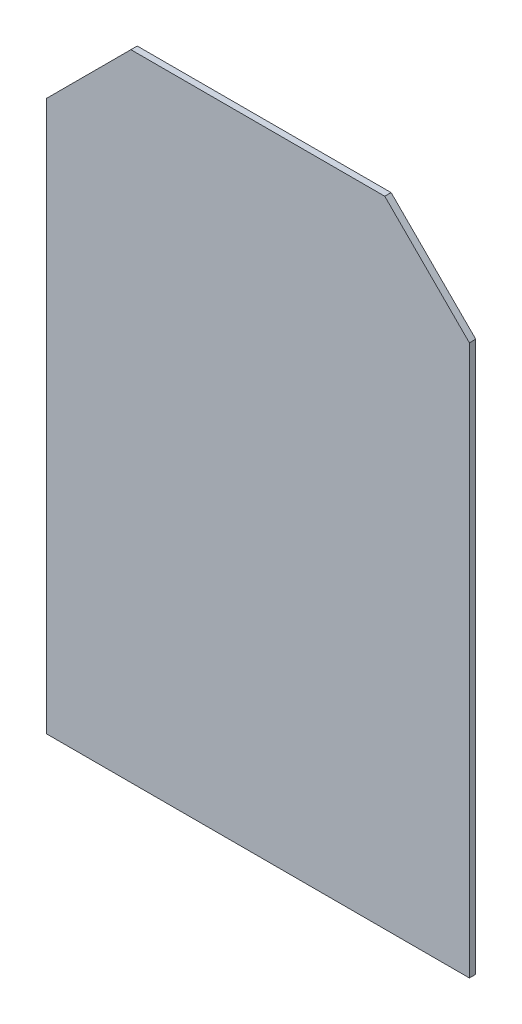
ISO-10303-21;
HEADER;
FILE_DESCRIPTION(('STEP AP214'),'2;1');
FILE_NAME('part.step','',(''),(''),'','','');
FILE_SCHEMA(('AUTOMOTIVE_DESIGN { 1 0 10303 214 1 1 1 1 }'));
ENDSEC;
DATA;
#1=APPLICATION_CONTEXT('core data for automotive mechanical design processes');
#2=APPLICATION_PROTOCOL_DEFINITION('international standard','automotive_design',2000,#1);
#3=PRODUCT_CONTEXT('',#1,'mechanical');
#4=PRODUCT('Part','Part','',(#3));
#5=PRODUCT_RELATED_PRODUCT_CATEGORY('part','',(#4));
#6=PRODUCT_DEFINITION_FORMATION('','',#4);
#7=PRODUCT_DEFINITION_CONTEXT('part definition',#1,'design');
#8=PRODUCT_DEFINITION('design','',#6,#7);
#9=PRODUCT_DEFINITION_SHAPE('','',#8);
#10=(LENGTH_UNIT() NAMED_UNIT(*) SI_UNIT(.MILLI.,.METRE.));
#11=(NAMED_UNIT(*) PLANE_ANGLE_UNIT() SI_UNIT($,.RADIAN.));
#12=(NAMED_UNIT(*) SI_UNIT($,.STERADIAN.) SOLID_ANGLE_UNIT());
#13=UNCERTAINTY_MEASURE_WITH_UNIT(LENGTH_MEASURE(1.E-05),#10,'distance_accuracy_value','');
#14=(GEOMETRIC_REPRESENTATION_CONTEXT(3) GLOBAL_UNCERTAINTY_ASSIGNED_CONTEXT((#13)) GLOBAL_UNIT_ASSIGNED_CONTEXT((#10,
#11,#12)) REPRESENTATION_CONTEXT('',''));
#15=CARTESIAN_POINT('',(0.,0.,0.));
#16=DIRECTION('',(0.,0.,1.));
#17=DIRECTION('',(1.,0.,0.));
#18=AXIS2_PLACEMENT_3D('',#15,#16,#17);
#19=CARTESIAN_POINT('',(10.,-15.,0.3));
#20=DIRECTION('',(-1.,0.,0.));
#21=DIRECTION('',(0.,0.,1.));
#22=AXIS2_PLACEMENT_3D('',#19,#20,#21);
#23=PLANE('',#22);
#24=DIRECTION('',(0.,1.,0.));
#25=VECTOR('',#24,1.);
#26=CARTESIAN_POINT('',(10.,-15.,0.));
#27=LINE('',#26,#25);
#28=CARTESIAN_POINT('',(10.,-15.,0.));
#29=VERTEX_POINT('',#28);
#30=CARTESIAN_POINT('',(10.,11.,0.));
#31=VERTEX_POINT('',#30);
#32=EDGE_CURVE('E120',#29,#31,#27,.T.);
#33=ORIENTED_EDGE('',*,*,#32,.T.);
#34=DIRECTION('',(0.,0.,1.));
#35=VECTOR('',#34,1.);
#36=CARTESIAN_POINT('',(10.,11.,0.3));
#37=LINE('',#36,#35);
#38=CARTESIAN_POINT('',(10.,11.,0.3));
#39=VERTEX_POINT('',#38);
#40=EDGE_CURVE('E11',#31,#39,#37,.T.);
#41=ORIENTED_EDGE('',*,*,#40,.T.);
#42=DIRECTION('',(0.,1.,0.));
#43=VECTOR('',#42,1.);
#44=CARTESIAN_POINT('',(10.,-15.,0.3));
#45=LINE('',#44,#43);
#46=CARTESIAN_POINT('',(10.,-15.,0.3));
#47=VERTEX_POINT('',#46);
#48=EDGE_CURVE('E126',#47,#39,#45,.T.);
#49=ORIENTED_EDGE('',*,*,#48,.F.);
#50=DIRECTION('',(0.,0.,-1.));
#51=VECTOR('',#50,1.);
#52=CARTESIAN_POINT('',(10.,-15.,0.3));
#53=LINE('',#52,#51);
#54=EDGE_CURVE('E112',#47,#29,#53,.T.);
#55=ORIENTED_EDGE('',*,*,#54,.T.);
#56=EDGE_LOOP('',(#33,#41,#49,#55));
#57=FACE_BOUND('',#56,.T.);
#58=ADVANCED_FACE('F37',(#57),#23,.F.);
#59=CARTESIAN_POINT('',(-10.,15.,0.3));
#60=DIRECTION('',(0.,-1.,0.));
#61=DIRECTION('',(0.,0.,-1.));
#62=AXIS2_PLACEMENT_3D('',#59,#60,#61);
#63=PLANE('',#62);
#64=DIRECTION('',(-1.,0.,0.));
#65=VECTOR('',#64,1.);
#66=CARTESIAN_POINT('',(-10.,15.,0.));
#67=LINE('',#66,#65);
#68=CARTESIAN_POINT('',(6.,15.,0.));
#69=VERTEX_POINT('',#68);
#70=CARTESIAN_POINT('',(-5.99999999999999,15.,0.));
#71=VERTEX_POINT('',#70);
#72=EDGE_CURVE('E122',#69,#71,#67,.T.);
#73=ORIENTED_EDGE('',*,*,#72,.T.);
#74=DIRECTION('',(0.,0.,1.));
#75=VECTOR('',#74,1.);
#76=CARTESIAN_POINT('',(-5.99999999999999,15.,0.3));
#77=LINE('',#76,#75);
#78=CARTESIAN_POINT('',(-5.99999999999999,15.,0.3));
#79=VERTEX_POINT('',#78);
#80=EDGE_CURVE('E59',#71,#79,#77,.T.);
#81=ORIENTED_EDGE('',*,*,#80,.T.);
#82=DIRECTION('',(-1.,0.,0.));
#83=VECTOR('',#82,1.);
#84=CARTESIAN_POINT('',(-10.,15.,0.3));
#85=LINE('',#84,#83);
#86=CARTESIAN_POINT('',(6.,15.,0.3));
#87=VERTEX_POINT('',#86);
#88=EDGE_CURVE('E102',#87,#79,#85,.T.);
#89=ORIENTED_EDGE('',*,*,#88,.F.);
#90=DIRECTION('',(0.,0.,-1.));
#91=VECTOR('',#90,1.);
#92=CARTESIAN_POINT('',(6.,15.,0.3));
#93=LINE('',#92,#91);
#94=EDGE_CURVE('E133',#87,#69,#93,.T.);
#95=ORIENTED_EDGE('',*,*,#94,.T.);
#96=EDGE_LOOP('',(#73,#81,#89,#95));
#97=FACE_BOUND('',#96,.T.);
#98=ADVANCED_FACE('F141',(#97),#63,.F.);
#99=CARTESIAN_POINT('',(-10.,-15.,0.3));
#100=DIRECTION('',(1.,0.,0.));
#101=DIRECTION('',(0.,0.,-1.));
#102=AXIS2_PLACEMENT_3D('',#99,#100,#101);
#103=PLANE('',#102);
#104=DIRECTION('',(0.,-1.,0.));
#105=VECTOR('',#104,1.);
#106=CARTESIAN_POINT('',(-10.,-15.,0.3));
#107=LINE('',#106,#105);
#108=CARTESIAN_POINT('',(-10.,11.,0.3));
#109=VERTEX_POINT('',#108);
#110=CARTESIAN_POINT('',(-10.,-15.,0.3));
#111=VERTEX_POINT('',#110);
#112=EDGE_CURVE('E92',#109,#111,#107,.T.);
#113=ORIENTED_EDGE('',*,*,#112,.F.);
#114=DIRECTION('',(0.,0.,-1.));
#115=VECTOR('',#114,1.);
#116=CARTESIAN_POINT('',(-10.,11.,0.3));
#117=LINE('',#116,#115);
#118=CARTESIAN_POINT('',(-10.,11.,0.));
#119=VERTEX_POINT('',#118);
#120=EDGE_CURVE('E111',#109,#119,#117,.T.);
#121=ORIENTED_EDGE('',*,*,#120,.T.);
#122=DIRECTION('',(0.,-1.,0.));
#123=VECTOR('',#122,1.);
#124=CARTESIAN_POINT('',(-10.,-15.,0.));
#125=LINE('',#124,#123);
#126=CARTESIAN_POINT('',(-10.,-15.,0.));
#127=VERTEX_POINT('',#126);
#128=EDGE_CURVE('E108',#119,#127,#125,.T.);
#129=ORIENTED_EDGE('',*,*,#128,.T.);
#130=DIRECTION('',(0.,0.,-1.));
#131=VECTOR('',#130,1.);
#132=CARTESIAN_POINT('',(-10.,-15.,0.3));
#133=LINE('',#132,#131);
#134=EDGE_CURVE('E105',#111,#127,#133,.T.);
#135=ORIENTED_EDGE('',*,*,#134,.F.);
#136=EDGE_LOOP('',(#113,#121,#129,#135));
#137=FACE_BOUND('',#136,.T.);
#138=ADVANCED_FACE('F106',(#137),#103,.F.);
#139=CARTESIAN_POINT('',(-10.,-15.,0.3));
#140=DIRECTION('',(0.,1.,0.));
#141=DIRECTION('',(0.,0.,1.));
#142=AXIS2_PLACEMENT_3D('',#139,#140,#141);
#143=PLANE('',#142);
#144=DIRECTION('',(1.,0.,0.));
#145=VECTOR('',#144,1.);
#146=CARTESIAN_POINT('',(-10.,-15.,0.));
#147=LINE('',#146,#145);
#148=EDGE_CURVE('E125',#127,#29,#147,.T.);
#149=ORIENTED_EDGE('',*,*,#148,.T.);
#150=ORIENTED_EDGE('',*,*,#54,.F.);
#151=DIRECTION('',(1.,0.,0.));
#152=VECTOR('',#151,1.);
#153=CARTESIAN_POINT('',(-10.,-15.,0.3));
#154=LINE('',#153,#152);
#155=EDGE_CURVE('E96',#111,#47,#154,.T.);
#156=ORIENTED_EDGE('',*,*,#155,.F.);
#157=ORIENTED_EDGE('',*,*,#134,.T.);
#158=EDGE_LOOP('',(#149,#150,#156,#157));
#159=FACE_BOUND('',#158,.T.);
#160=ADVANCED_FACE('F114',(#159),#143,.F.);
#161=CARTESIAN_POINT('',(0.,0.,0.3));
#162=DIRECTION('',(0.,0.,-1.));
#163=DIRECTION('',(-1.,0.,0.));
#164=AXIS2_PLACEMENT_3D('',#161,#162,#163);
#165=PLANE('',#164);
#166=ORIENTED_EDGE('',*,*,#88,.T.);
#167=DIRECTION('',(0.707106781186548,0.707106781186547,0.));
#168=VECTOR('',#167,1.);
#169=CARTESIAN_POINT('',(-10.,11.,0.3));
#170=LINE('',#169,#168);
#171=EDGE_CURVE('E46',#79,#109,#170,.F.);
#172=ORIENTED_EDGE('',*,*,#171,.T.);
#173=ORIENTED_EDGE('',*,*,#112,.T.);
#174=ORIENTED_EDGE('',*,*,#155,.T.);
#175=ORIENTED_EDGE('',*,*,#48,.T.);
#176=DIRECTION('',(0.707106781186547,-0.707106781186548,0.));
#177=VECTOR('',#176,1.);
#178=CARTESIAN_POINT('',(6.,15.,0.3));
#179=LINE('',#178,#177);
#180=EDGE_CURVE('E137',#39,#87,#179,.F.);
#181=ORIENTED_EDGE('',*,*,#180,.T.);
#182=EDGE_LOOP('',(#166,#172,#173,#174,#175,#181));
#183=FACE_BOUND('',#182,.T.);
#184=ADVANCED_FACE('F94',(#183),#165,.F.);
#185=CARTESIAN_POINT('',(0.,0.,0.));
#186=DIRECTION('',(0.,0.,-1.));
#187=DIRECTION('',(-1.,0.,0.));
#188=AXIS2_PLACEMENT_3D('',#185,#186,#187);
#189=PLANE('',#188);
#190=ORIENTED_EDGE('',*,*,#128,.F.);
#191=DIRECTION('',(-0.707106781186548,-0.707106781186547,0.));
#192=VECTOR('',#191,1.);
#193=CARTESIAN_POINT('',(-10.5,10.5,0.));
#194=LINE('',#193,#192);
#195=EDGE_CURVE('E131',#119,#71,#194,.F.);
#196=ORIENTED_EDGE('',*,*,#195,.T.);
#197=ORIENTED_EDGE('',*,*,#72,.F.);
#198=DIRECTION('',(-0.707106781186547,0.707106781186548,0.));
#199=VECTOR('',#198,1.);
#200=CARTESIAN_POINT('',(10.5,10.5,0.));
#201=LINE('',#200,#199);
#202=EDGE_CURVE('E129',#69,#31,#201,.F.);
#203=ORIENTED_EDGE('',*,*,#202,.T.);
#204=ORIENTED_EDGE('',*,*,#32,.F.);
#205=ORIENTED_EDGE('',*,*,#148,.F.);
#206=EDGE_LOOP('',(#190,#196,#197,#203,#204,#205));
#207=FACE_BOUND('',#206,.T.);
#208=ADVANCED_FACE('F145',(#207),#189,.T.);
#209=CARTESIAN_POINT('',(-10.,11.,0.3));
#210=DIRECTION('',(0.707106781186547,-0.707106781186548,0.));
#211=DIRECTION('',(0.,0.,-1.));
#212=AXIS2_PLACEMENT_3D('',#209,#210,#211);
#213=PLANE('',#212);
#214=ORIENTED_EDGE('',*,*,#171,.F.);
#215=ORIENTED_EDGE('',*,*,#80,.F.);
#216=ORIENTED_EDGE('',*,*,#195,.F.);
#217=ORIENTED_EDGE('',*,*,#120,.F.);
#218=EDGE_LOOP('',(#214,#215,#216,#217));
#219=FACE_BOUND('',#218,.T.);
#220=ADVANCED_FACE('F155',(#219),#213,.F.);
#221=CARTESIAN_POINT('',(6.,15.,0.3));
#222=DIRECTION('',(-0.707106781186548,-0.707106781186547,0.));
#223=DIRECTION('',(0.,0.,-1.));
#224=AXIS2_PLACEMENT_3D('',#221,#222,#223);
#225=PLANE('',#224);
#226=ORIENTED_EDGE('',*,*,#180,.F.);
#227=ORIENTED_EDGE('',*,*,#40,.F.);
#228=ORIENTED_EDGE('',*,*,#202,.F.);
#229=ORIENTED_EDGE('',*,*,#94,.F.);
#230=EDGE_LOOP('',(#226,#227,#228,#229));
#231=FACE_BOUND('',#230,.T.);
#232=ADVANCED_FACE('F40',(#231),#225,.F.);
#233=CLOSED_SHELL('',(#58,#98,#138,#160,#184,#208,#220,#232));
#234=MANIFOLD_SOLID_BREP('B2',#233);
#235=ADVANCED_BREP_SHAPE_REPRESENTATION('',(#18,#234),#14);
#236=SHAPE_DEFINITION_REPRESENTATION(#9,#235);
ENDSEC;
END-ISO-10303-21;
